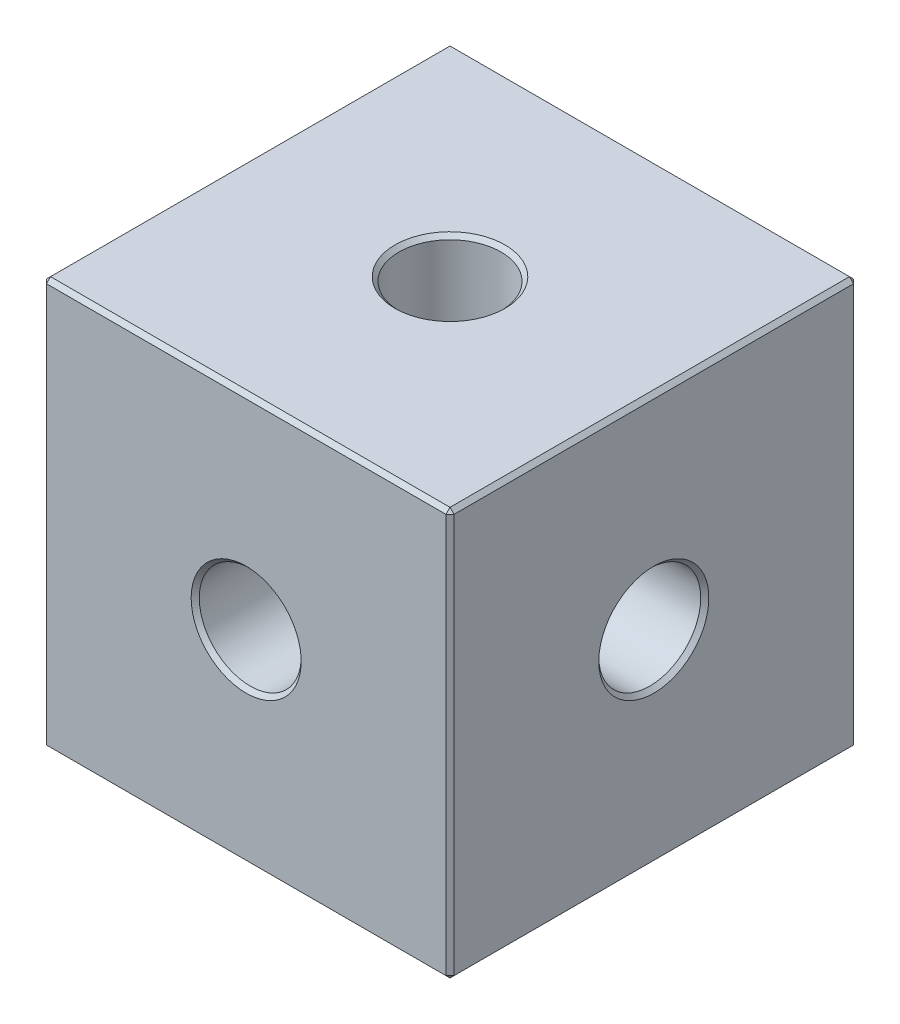
ISO-10303-21;
HEADER;
FILE_DESCRIPTION(('STEP AP214'),'2;1');
FILE_NAME('part.step','',(''),(''),'','','');
FILE_SCHEMA(('AUTOMOTIVE_DESIGN { 1 0 10303 214 1 1 1 1 }'));
ENDSEC;
DATA;
#1=APPLICATION_CONTEXT('core data for automotive mechanical design processes');
#2=APPLICATION_PROTOCOL_DEFINITION('international standard','automotive_design',2000,#1);
#3=PRODUCT_CONTEXT('',#1,'mechanical');
#4=PRODUCT('Part','Part','',(#3));
#5=PRODUCT_RELATED_PRODUCT_CATEGORY('part','',(#4));
#6=PRODUCT_DEFINITION_FORMATION('','',#4);
#7=PRODUCT_DEFINITION_CONTEXT('part definition',#1,'design');
#8=PRODUCT_DEFINITION('design','',#6,#7);
#9=PRODUCT_DEFINITION_SHAPE('','',#8);
#10=(LENGTH_UNIT() NAMED_UNIT(*) SI_UNIT(.MILLI.,.METRE.));
#11=(NAMED_UNIT(*) PLANE_ANGLE_UNIT() SI_UNIT($,.RADIAN.));
#12=(NAMED_UNIT(*) SI_UNIT($,.STERADIAN.) SOLID_ANGLE_UNIT());
#13=UNCERTAINTY_MEASURE_WITH_UNIT(LENGTH_MEASURE(1.E-05),#10,'distance_accuracy_value','');
#14=(GEOMETRIC_REPRESENTATION_CONTEXT(3) GLOBAL_UNCERTAINTY_ASSIGNED_CONTEXT((#13)) GLOBAL_UNIT_ASSIGNED_CONTEXT((#10,
#11,#12)) REPRESENTATION_CONTEXT('',''));
#15=CARTESIAN_POINT('',(0.,0.,0.));
#16=DIRECTION('',(0.,0.,1.));
#17=DIRECTION('',(1.,0.,0.));
#18=AXIS2_PLACEMENT_3D('',#15,#16,#17);
#19=CARTESIAN_POINT('',(0.,0.,10.));
#20=DIRECTION('',(0.,0.,1.));
#21=DIRECTION('',(1.,0.,0.));
#22=AXIS2_PLACEMENT_3D('',#19,#20,#21);
#23=CYLINDRICAL_SURFACE('',#22,2.5);
#24=CARTESIAN_POINT('',(0.,0.,9.80000000000002));
#25=DIRECTION('',(0.,0.,-1.));
#26=DIRECTION('',(-1.,0.,0.));
#27=AXIS2_PLACEMENT_3D('',#24,#25,#26);
#28=CIRCLE('',#27,2.5);
#29=CARTESIAN_POINT('',(-2.5,0.,9.80000000000002));
#30=VERTEX_POINT('',#29);
#31=EDGE_CURVE('E251',#30,#30,#28,.F.);
#32=ORIENTED_EDGE('',*,*,#31,.T.);
#33=EDGE_LOOP('',(#32));
#34=FACE_BOUND('',#33,.T.);
#35=CARTESIAN_POINT('',(0.,0.,0.));
#36=DIRECTION('',(0.,0.707106781186547,0.707106781186547));
#37=DIRECTION('',(0.,-0.707106781186547,0.707106781186547));
#38=AXIS2_PLACEMENT_3D('',#35,#36,#37);
#39=ELLIPSE('',#38,3.53553390593273,2.5);
#40=CARTESIAN_POINT('',(1.76776695296637,-1.76776695296637,1.76776695296637));
#41=VERTEX_POINT('',#40);
#42=CARTESIAN_POINT('',(-1.76776695296637,-1.76776695296637,1.76776695296637));
#43=VERTEX_POINT('',#42);
#44=EDGE_CURVE('E167',#41,#43,#39,.F.);
#45=ORIENTED_EDGE('',*,*,#44,.T.);
#46=CARTESIAN_POINT('',(0.,0.,0.));
#47=DIRECTION('',(0.707106781186548,0.,0.707106781186547));
#48=DIRECTION('',(-0.707106781186547,0.,0.707106781186547));
#49=AXIS2_PLACEMENT_3D('',#46,#47,#48);
#50=ELLIPSE('',#49,3.53553390593273,2.5);
#51=CARTESIAN_POINT('',(-1.76776695296637,1.76776695296637,1.76776695296637));
#52=VERTEX_POINT('',#51);
#53=EDGE_CURVE('E161',#43,#52,#50,.F.);
#54=ORIENTED_EDGE('',*,*,#53,.T.);
#55=CARTESIAN_POINT('',(0.,0.,0.));
#56=DIRECTION('',(0.,-0.707106781186547,0.707106781186547));
#57=DIRECTION('',(0.,0.707106781186547,0.707106781186547));
#58=AXIS2_PLACEMENT_3D('',#55,#56,#57);
#59=ELLIPSE('',#58,3.53553390593273,2.5);
#60=CARTESIAN_POINT('',(1.76776695296637,1.76776695296637,1.76776695296637));
#61=VERTEX_POINT('',#60);
#62=EDGE_CURVE('E181',#52,#61,#59,.F.);
#63=ORIENTED_EDGE('',*,*,#62,.T.);
#64=CARTESIAN_POINT('',(0.,0.,0.));
#65=DIRECTION('',(-0.707106781186547,0.,0.707106781186547));
#66=DIRECTION('',(0.707106781186548,0.,0.707106781186547));
#67=AXIS2_PLACEMENT_3D('',#64,#65,#66);
#68=ELLIPSE('',#67,3.53553390593273,2.5);
#69=EDGE_CURVE('E618',#61,#41,#68,.F.);
#70=ORIENTED_EDGE('',*,*,#69,.T.);
#71=EDGE_LOOP('',(#45,#54,#63,#70));
#72=FACE_BOUND('',#71,.T.);
#73=ADVANCED_FACE('F41',(#34,#72),#23,.F.);
#74=CARTESIAN_POINT('',(10.,10.,-10.));
#75=DIRECTION('',(-1.,0.,0.));
#76=DIRECTION('',(0.,0.,1.));
#77=AXIS2_PLACEMENT_3D('',#74,#75,#76);
#78=PLANE('',#77);
#79=CARTESIAN_POINT('',(10.,0.,0.));
#80=DIRECTION('',(-1.,0.,0.));
#81=DIRECTION('',(0.,0.,1.));
#82=AXIS2_PLACEMENT_3D('',#79,#80,#81);
#83=CIRCLE('',#82,2.7);
#84=CARTESIAN_POINT('',(10.,0.,2.7));
#85=VERTEX_POINT('',#84);
#86=EDGE_CURVE('E248',#85,#85,#83,.T.);
#87=ORIENTED_EDGE('',*,*,#86,.T.);
#88=EDGE_LOOP('',(#87));
#89=FACE_BOUND('',#88,.T.);
#90=DIRECTION('',(0.,0.,-1.));
#91=VECTOR('',#90,1.);
#92=CARTESIAN_POINT('',(10.,-9.8,-10.));
#93=LINE('',#92,#91);
#94=CARTESIAN_POINT('',(10.,-9.8,9.8));
#95=VERTEX_POINT('',#94);
#96=CARTESIAN_POINT('',(10.,-9.8,-9.8));
#97=VERTEX_POINT('',#96);
#98=EDGE_CURVE('E243',#95,#97,#93,.T.);
#99=ORIENTED_EDGE('',*,*,#98,.T.);
#100=DIRECTION('',(0.,1.,0.));
#101=VECTOR('',#100,1.);
#102=CARTESIAN_POINT('',(10.,10.,-9.8));
#103=LINE('',#102,#101);
#104=CARTESIAN_POINT('',(10.,9.8,-9.8));
#105=VERTEX_POINT('',#104);
#106=EDGE_CURVE('E245',#97,#105,#103,.T.);
#107=ORIENTED_EDGE('',*,*,#106,.T.);
#108=DIRECTION('',(0.,0.,1.));
#109=VECTOR('',#108,1.);
#110=CARTESIAN_POINT('',(10.,9.8,10.));
#111=LINE('',#110,#109);
#112=CARTESIAN_POINT('',(10.,9.8,9.8));
#113=VERTEX_POINT('',#112);
#114=EDGE_CURVE('E239',#105,#113,#111,.T.);
#115=ORIENTED_EDGE('',*,*,#114,.T.);
#116=DIRECTION('',(0.,-1.,0.));
#117=VECTOR('',#116,1.);
#118=CARTESIAN_POINT('',(10.,10.,9.8));
#119=LINE('',#118,#117);
#120=EDGE_CURVE('E241',#113,#95,#119,.T.);
#121=ORIENTED_EDGE('',*,*,#120,.T.);
#122=EDGE_LOOP('',(#99,#107,#115,#121));
#123=FACE_BOUND('',#122,.T.);
#124=ADVANCED_FACE('F352',(#89,#123),#78,.F.);
#125=CARTESIAN_POINT('',(-10.,10.,-10.));
#126=DIRECTION('',(0.,0.,1.));
#127=DIRECTION('',(1.,0.,0.));
#128=AXIS2_PLACEMENT_3D('',#125,#126,#127);
#129=PLANE('',#128);
#130=CARTESIAN_POINT('',(0.,0.,-10.));
#131=DIRECTION('',(0.,0.,1.));
#132=DIRECTION('',(1.,0.,0.));
#133=AXIS2_PLACEMENT_3D('',#130,#131,#132);
#134=CIRCLE('',#133,2.69999999999999);
#135=CARTESIAN_POINT('',(2.69999999999999,0.,-10.));
#136=VERTEX_POINT('',#135);
#137=EDGE_CURVE('E230',#136,#136,#134,.T.);
#138=ORIENTED_EDGE('',*,*,#137,.T.);
#139=EDGE_LOOP('',(#138));
#140=FACE_BOUND('',#139,.T.);
#141=DIRECTION('',(-1.,0.,0.));
#142=VECTOR('',#141,1.);
#143=CARTESIAN_POINT('',(-10.,-9.8,-10.));
#144=LINE('',#143,#142);
#145=CARTESIAN_POINT('',(9.8,-9.8,-10.));
#146=VERTEX_POINT('',#145);
#147=CARTESIAN_POINT('',(-9.80000000000001,-9.8,-10.));
#148=VERTEX_POINT('',#147);
#149=EDGE_CURVE('E225',#146,#148,#144,.T.);
#150=ORIENTED_EDGE('',*,*,#149,.T.);
#151=DIRECTION('',(0.,1.,0.));
#152=VECTOR('',#151,1.);
#153=CARTESIAN_POINT('',(-9.80000000000001,10.,-10.));
#154=LINE('',#153,#152);
#155=CARTESIAN_POINT('',(-9.80000000000001,9.8,-10.));
#156=VERTEX_POINT('',#155);
#157=EDGE_CURVE('E227',#148,#156,#154,.T.);
#158=ORIENTED_EDGE('',*,*,#157,.T.);
#159=DIRECTION('',(1.,0.,0.));
#160=VECTOR('',#159,1.);
#161=CARTESIAN_POINT('',(10.,9.8,-10.));
#162=LINE('',#161,#160);
#163=CARTESIAN_POINT('',(9.8,9.8,-10.));
#164=VERTEX_POINT('',#163);
#165=EDGE_CURVE('E221',#156,#164,#162,.T.);
#166=ORIENTED_EDGE('',*,*,#165,.T.);
#167=DIRECTION('',(0.,-1.,0.));
#168=VECTOR('',#167,1.);
#169=CARTESIAN_POINT('',(9.8,10.,-10.));
#170=LINE('',#169,#168);
#171=EDGE_CURVE('E223',#164,#146,#170,.T.);
#172=ORIENTED_EDGE('',*,*,#171,.T.);
#173=EDGE_LOOP('',(#150,#158,#166,#172));
#174=FACE_BOUND('',#173,.T.);
#175=ADVANCED_FACE('F373',(#140,#174),#129,.F.);
#176=CARTESIAN_POINT('',(-10.,10.,-10.));
#177=DIRECTION('',(1.,0.,0.));
#178=DIRECTION('',(0.,0.,-1.));
#179=AXIS2_PLACEMENT_3D('',#176,#177,#178);
#180=PLANE('',#179);
#181=CARTESIAN_POINT('',(-10.,0.,0.));
#182=DIRECTION('',(1.,0.,0.));
#183=DIRECTION('',(0.,0.,-1.));
#184=AXIS2_PLACEMENT_3D('',#181,#182,#183);
#185=CIRCLE('',#184,2.69999999999998);
#186=CARTESIAN_POINT('',(-10.,0.,-2.69999999999998));
#187=VERTEX_POINT('',#186);
#188=EDGE_CURVE('E215',#187,#187,#185,.T.);
#189=ORIENTED_EDGE('',*,*,#188,.T.);
#190=EDGE_LOOP('',(#189));
#191=FACE_BOUND('',#190,.T.);
#192=DIRECTION('',(0.,-1.,0.));
#193=VECTOR('',#192,1.);
#194=CARTESIAN_POINT('',(-10.,10.,-9.8));
#195=LINE('',#194,#193);
#196=CARTESIAN_POINT('',(-10.,9.8,-9.8));
#197=VERTEX_POINT('',#196);
#198=CARTESIAN_POINT('',(-10.,-9.8,-9.8));
#199=VERTEX_POINT('',#198);
#200=EDGE_CURVE('E210',#197,#199,#195,.T.);
#201=ORIENTED_EDGE('',*,*,#200,.T.);
#202=DIRECTION('',(0.,0.,1.));
#203=VECTOR('',#202,1.);
#204=CARTESIAN_POINT('',(-10.,-9.8,-10.));
#205=LINE('',#204,#203);
#206=CARTESIAN_POINT('',(-10.,-9.8,9.8));
#207=VERTEX_POINT('',#206);
#208=EDGE_CURVE('E212',#199,#207,#205,.T.);
#209=ORIENTED_EDGE('',*,*,#208,.T.);
#210=DIRECTION('',(0.,1.,0.));
#211=VECTOR('',#210,1.);
#212=CARTESIAN_POINT('',(-10.,10.,9.8));
#213=LINE('',#212,#211);
#214=CARTESIAN_POINT('',(-10.,9.8,9.8));
#215=VERTEX_POINT('',#214);
#216=EDGE_CURVE('E208',#207,#215,#213,.T.);
#217=ORIENTED_EDGE('',*,*,#216,.T.);
#218=DIRECTION('',(0.,0.,-1.));
#219=VECTOR('',#218,1.);
#220=CARTESIAN_POINT('',(-10.,9.8,-10.));
#221=LINE('',#220,#219);
#222=EDGE_CURVE('E206',#215,#197,#221,.T.);
#223=ORIENTED_EDGE('',*,*,#222,.T.);
#224=EDGE_LOOP('',(#201,#209,#217,#223));
#225=FACE_BOUND('',#224,.T.);
#226=ADVANCED_FACE('F434',(#191,#225),#180,.F.);
#227=CARTESIAN_POINT('',(-10.,10.,10.));
#228=DIRECTION('',(0.,0.,-1.));
#229=DIRECTION('',(-1.,0.,0.));
#230=AXIS2_PLACEMENT_3D('',#227,#228,#229);
#231=PLANE('',#230);
#232=CARTESIAN_POINT('',(0.,0.,10.));
#233=DIRECTION('',(0.,0.,-1.));
#234=DIRECTION('',(-1.,0.,0.));
#235=AXIS2_PLACEMENT_3D('',#232,#233,#234);
#236=CIRCLE('',#235,2.69999999999998);
#237=CARTESIAN_POINT('',(-2.69999999999998,0.,10.));
#238=VERTEX_POINT('',#237);
#239=EDGE_CURVE('E263',#238,#238,#236,.T.);
#240=ORIENTED_EDGE('',*,*,#239,.T.);
#241=EDGE_LOOP('',(#240));
#242=FACE_BOUND('',#241,.T.);
#243=DIRECTION('',(-1.,0.,0.));
#244=VECTOR('',#243,1.);
#245=CARTESIAN_POINT('',(-10.,9.8,10.));
#246=LINE('',#245,#244);
#247=CARTESIAN_POINT('',(9.80000000000001,9.8,10.));
#248=VERTEX_POINT('',#247);
#249=CARTESIAN_POINT('',(-9.8,9.8,10.));
#250=VERTEX_POINT('',#249);
#251=EDGE_CURVE('E254',#248,#250,#246,.T.);
#252=ORIENTED_EDGE('',*,*,#251,.T.);
#253=DIRECTION('',(0.,-1.,0.));
#254=VECTOR('',#253,1.);
#255=CARTESIAN_POINT('',(-9.8,10.,10.));
#256=LINE('',#255,#254);
#257=CARTESIAN_POINT('',(-9.8,-9.8,10.));
#258=VERTEX_POINT('',#257);
#259=EDGE_CURVE('E260',#250,#258,#256,.T.);
#260=ORIENTED_EDGE('',*,*,#259,.T.);
#261=DIRECTION('',(1.,0.,0.));
#262=VECTOR('',#261,1.);
#263=CARTESIAN_POINT('',(-10.,-9.8,10.));
#264=LINE('',#263,#262);
#265=CARTESIAN_POINT('',(9.80000000000001,-9.8,10.));
#266=VERTEX_POINT('',#265);
#267=EDGE_CURVE('E258',#258,#266,#264,.T.);
#268=ORIENTED_EDGE('',*,*,#267,.T.);
#269=DIRECTION('',(0.,1.,0.));
#270=VECTOR('',#269,1.);
#271=CARTESIAN_POINT('',(9.80000000000001,10.,10.));
#272=LINE('',#271,#270);
#273=EDGE_CURVE('E256',#266,#248,#272,.T.);
#274=ORIENTED_EDGE('',*,*,#273,.T.);
#275=EDGE_LOOP('',(#252,#260,#268,#274));
#276=FACE_BOUND('',#275,.T.);
#277=ADVANCED_FACE('F439',(#242,#276),#231,.F.);
#278=CARTESIAN_POINT('',(0.,10.,0.));
#279=DIRECTION('',(0.,1.,0.));
#280=DIRECTION('',(0.,0.,1.));
#281=AXIS2_PLACEMENT_3D('',#278,#279,#280);
#282=PLANE('',#281);
#283=DIRECTION('',(0.,0.,1.));
#284=VECTOR('',#283,1.);
#285=CARTESIAN_POINT('',(-9.8,10.,10.));
#286=LINE('',#285,#284);
#287=CARTESIAN_POINT('',(-9.80000000000001,10.,-9.8));
#288=VERTEX_POINT('',#287);
#289=CARTESIAN_POINT('',(-9.8,10.,9.80000000000001));
#290=VERTEX_POINT('',#289);
#291=EDGE_CURVE('E59',#288,#290,#286,.T.);
#292=ORIENTED_EDGE('',*,*,#291,.T.);
#293=DIRECTION('',(1.,0.,0.));
#294=VECTOR('',#293,1.);
#295=CARTESIAN_POINT('',(10.,10.,9.80000000000001));
#296=LINE('',#295,#294);
#297=CARTESIAN_POINT('',(9.80000000000001,10.,9.80000000000001));
#298=VERTEX_POINT('',#297);
#299=EDGE_CURVE('E51',#290,#298,#296,.T.);
#300=ORIENTED_EDGE('',*,*,#299,.T.);
#301=DIRECTION('',(0.,0.,-1.));
#302=VECTOR('',#301,1.);
#303=CARTESIAN_POINT('',(9.8,10.,-10.));
#304=LINE('',#303,#302);
#305=CARTESIAN_POINT('',(9.8,10.,-9.8));
#306=VERTEX_POINT('',#305);
#307=EDGE_CURVE('E269',#298,#306,#304,.T.);
#308=ORIENTED_EDGE('',*,*,#307,.T.);
#309=DIRECTION('',(-1.,0.,0.));
#310=VECTOR('',#309,1.);
#311=CARTESIAN_POINT('',(-10.,10.,-9.8));
#312=LINE('',#311,#310);
#313=EDGE_CURVE('E64',#306,#288,#312,.T.);
#314=ORIENTED_EDGE('',*,*,#313,.T.);
#315=EDGE_LOOP('',(#292,#300,#308,#314));
#316=FACE_BOUND('',#315,.T.);
#317=CARTESIAN_POINT('',(0.,10.,0.));
#318=DIRECTION('',(0.,1.,0.));
#319=DIRECTION('',(0.,0.,1.));
#320=AXIS2_PLACEMENT_3D('',#317,#318,#319);
#321=CIRCLE('',#320,2.7);
#322=CARTESIAN_POINT('',(0.,10.,2.7));
#323=VERTEX_POINT('',#322);
#324=EDGE_CURVE('E266',#323,#323,#321,.F.);
#325=ORIENTED_EDGE('',*,*,#324,.T.);
#326=EDGE_LOOP('',(#325));
#327=FACE_BOUND('',#326,.T.);
#328=ADVANCED_FACE('F420',(#316,#327),#282,.T.);
#329=CARTESIAN_POINT('',(0.,-10.,0.));
#330=DIRECTION('',(0.,1.,0.));
#331=DIRECTION('',(0.,0.,1.));
#332=AXIS2_PLACEMENT_3D('',#329,#330,#331);
#333=PLANE('',#332);
#334=CARTESIAN_POINT('',(0.,-10.,0.));
#335=DIRECTION('',(0.,1.,0.));
#336=DIRECTION('',(0.,0.,1.));
#337=AXIS2_PLACEMENT_3D('',#334,#335,#336);
#338=CIRCLE('',#337,2.69999999999999);
#339=CARTESIAN_POINT('',(0.,-10.,2.69999999999999));
#340=VERTEX_POINT('',#339);
#341=EDGE_CURVE('E200',#340,#340,#338,.T.);
#342=ORIENTED_EDGE('',*,*,#341,.T.);
#343=EDGE_LOOP('',(#342));
#344=FACE_BOUND('',#343,.T.);
#345=DIRECTION('',(-1.,0.,0.));
#346=VECTOR('',#345,1.);
#347=CARTESIAN_POINT('',(0.,-10.,9.80000000000001));
#348=LINE('',#347,#346);
#349=CARTESIAN_POINT('',(9.80000000000001,-10.,9.80000000000001));
#350=VERTEX_POINT('',#349);
#351=CARTESIAN_POINT('',(-9.8,-10.,9.80000000000001));
#352=VERTEX_POINT('',#351);
#353=EDGE_CURVE('E191',#350,#352,#348,.T.);
#354=ORIENTED_EDGE('',*,*,#353,.T.);
#355=DIRECTION('',(0.,0.,-1.));
#356=VECTOR('',#355,1.);
#357=CARTESIAN_POINT('',(-9.8,-10.,0.));
#358=LINE('',#357,#356);
#359=CARTESIAN_POINT('',(-9.80000000000001,-10.,-9.8));
#360=VERTEX_POINT('',#359);
#361=EDGE_CURVE('E197',#352,#360,#358,.T.);
#362=ORIENTED_EDGE('',*,*,#361,.T.);
#363=DIRECTION('',(1.,0.,0.));
#364=VECTOR('',#363,1.);
#365=CARTESIAN_POINT('',(0.,-10.,-9.8));
#366=LINE('',#365,#364);
#367=CARTESIAN_POINT('',(9.8,-10.,-9.8));
#368=VERTEX_POINT('',#367);
#369=EDGE_CURVE('E195',#360,#368,#366,.T.);
#370=ORIENTED_EDGE('',*,*,#369,.T.);
#371=DIRECTION('',(0.,0.,1.));
#372=VECTOR('',#371,1.);
#373=CARTESIAN_POINT('',(9.8,-10.,0.));
#374=LINE('',#373,#372);
#375=EDGE_CURVE('E193',#368,#350,#374,.T.);
#376=ORIENTED_EDGE('',*,*,#375,.T.);
#377=EDGE_LOOP('',(#354,#362,#370,#376));
#378=FACE_BOUND('',#377,.T.);
#379=ADVANCED_FACE('F413',(#344,#378),#333,.F.);
#380=CARTESIAN_POINT('',(0.,0.,-9.8));
#381=DIRECTION('',(0.,0.,1.));
#382=DIRECTION('',(1.,0.,0.));
#383=AXIS2_PLACEMENT_3D('',#380,#381,#382);
#384=CIRCLE('',#383,2.5);
#385=CARTESIAN_POINT('',(2.5,0.,-9.8));
#386=VERTEX_POINT('',#385);
#387=EDGE_CURVE('E233',#386,#386,#384,.F.);
#388=ORIENTED_EDGE('',*,*,#387,.T.);
#389=EDGE_LOOP('',(#388));
#390=FACE_BOUND('',#389,.T.);
#391=CARTESIAN_POINT('',(0.,0.,0.));
#392=DIRECTION('',(0.,-0.707106781186547,0.707106781186547));
#393=DIRECTION('',(0.,0.707106781186547,0.707106781186547));
#394=AXIS2_PLACEMENT_3D('',#391,#392,#393);
#395=ELLIPSE('',#394,3.53553390593273,2.5);
#396=CARTESIAN_POINT('',(-1.76776695296637,-1.76776695296637,-1.76776695296637));
#397=VERTEX_POINT('',#396);
#398=CARTESIAN_POINT('',(1.76776695296637,-1.76776695296637,-1.76776695296637));
#399=VERTEX_POINT('',#398);
#400=EDGE_CURVE('E174',#397,#399,#395,.T.);
#401=ORIENTED_EDGE('',*,*,#400,.T.);
#402=CARTESIAN_POINT('',(0.,0.,0.));
#403=DIRECTION('',(0.707106781186548,0.,0.707106781186547));
#404=DIRECTION('',(-0.707106781186547,0.,0.707106781186547));
#405=AXIS2_PLACEMENT_3D('',#402,#403,#404);
#406=ELLIPSE('',#405,3.53553390593273,2.5);
#407=CARTESIAN_POINT('',(1.76776695296637,1.76776695296637,-1.76776695296637));
#408=VERTEX_POINT('',#407);
#409=EDGE_CURVE('E619',#399,#408,#406,.T.);
#410=ORIENTED_EDGE('',*,*,#409,.T.);
#411=CARTESIAN_POINT('',(0.,0.,0.));
#412=DIRECTION('',(0.,0.707106781186547,0.707106781186547));
#413=DIRECTION('',(0.,-0.707106781186547,0.707106781186547));
#414=AXIS2_PLACEMENT_3D('',#411,#412,#413);
#415=ELLIPSE('',#414,3.53553390593273,2.5);
#416=CARTESIAN_POINT('',(-1.76776695296637,1.76776695296637,-1.76776695296637));
#417=VERTEX_POINT('',#416);
#418=EDGE_CURVE('E176',#408,#417,#415,.T.);
#419=ORIENTED_EDGE('',*,*,#418,.T.);
#420=CARTESIAN_POINT('',(0.,0.,0.));
#421=DIRECTION('',(-0.707106781186547,0.,0.707106781186547));
#422=DIRECTION('',(0.707106781186548,0.,0.707106781186547));
#423=AXIS2_PLACEMENT_3D('',#420,#421,#422);
#424=ELLIPSE('',#423,3.53553390593273,2.5);
#425=EDGE_CURVE('E158',#417,#397,#424,.T.);
#426=ORIENTED_EDGE('',*,*,#425,.T.);
#427=EDGE_LOOP('',(#401,#410,#419,#426));
#428=FACE_BOUND('',#427,.T.);
#429=ADVANCED_FACE('F172',(#390,#428),#23,.F.);
#430=CARTESIAN_POINT('',(0.,10.,0.));
#431=DIRECTION('',(0.,1.,0.));
#432=DIRECTION('',(0.,0.,1.));
#433=AXIS2_PLACEMENT_3D('',#430,#431,#432);
#434=CYLINDRICAL_SURFACE('',#433,2.5);
#435=CARTESIAN_POINT('',(0.,9.79999999999999,0.));
#436=DIRECTION('',(0.,1.,0.));
#437=DIRECTION('',(0.,0.,1.));
#438=AXIS2_PLACEMENT_3D('',#435,#436,#437);
#439=CIRCLE('',#438,2.5);
#440=CARTESIAN_POINT('',(0.,9.79999999999999,2.5));
#441=VERTEX_POINT('',#440);
#442=EDGE_CURVE('E11',#441,#441,#439,.T.);
#443=ORIENTED_EDGE('',*,*,#442,.T.);
#444=EDGE_LOOP('',(#443));
#445=FACE_BOUND('',#444,.T.);
#446=ORIENTED_EDGE('',*,*,#62,.F.);
#447=CARTESIAN_POINT('',(0.,0.,0.));
#448=DIRECTION('',(0.707106781186547,0.707106781186547,0.));
#449=DIRECTION('',(-0.707106781186547,0.707106781186547,0.));
#450=AXIS2_PLACEMENT_3D('',#447,#448,#449);
#451=ELLIPSE('',#450,3.53553390593273,2.5);
#452=EDGE_CURVE('E177',#52,#417,#451,.F.);
#453=ORIENTED_EDGE('',*,*,#452,.T.);
#454=ORIENTED_EDGE('',*,*,#418,.F.);
#455=CARTESIAN_POINT('',(0.,0.,0.));
#456=DIRECTION('',(-0.707106781186547,0.707106781186547,0.));
#457=DIRECTION('',(0.707106781186547,0.707106781186547,0.));
#458=AXIS2_PLACEMENT_3D('',#455,#456,#457);
#459=ELLIPSE('',#458,3.53553390593273,2.5);
#460=EDGE_CURVE('E185',#408,#61,#459,.F.);
#461=ORIENTED_EDGE('',*,*,#460,.T.);
#462=EDGE_LOOP('',(#446,#453,#454,#461));
#463=FACE_BOUND('',#462,.T.);
#464=ADVANCED_FACE('F412',(#445,#463),#434,.F.);
#465=CARTESIAN_POINT('',(0.,-9.8,0.));
#466=DIRECTION('',(0.,1.,0.));
#467=DIRECTION('',(0.,0.,1.));
#468=AXIS2_PLACEMENT_3D('',#465,#466,#467);
#469=CIRCLE('',#468,2.5);
#470=CARTESIAN_POINT('',(0.,-9.8,2.5));
#471=VERTEX_POINT('',#470);
#472=EDGE_CURVE('E203',#471,#471,#469,.F.);
#473=ORIENTED_EDGE('',*,*,#472,.T.);
#474=EDGE_LOOP('',(#473));
#475=FACE_BOUND('',#474,.T.);
#476=ORIENTED_EDGE('',*,*,#44,.F.);
#477=CARTESIAN_POINT('',(0.,0.,0.));
#478=DIRECTION('',(0.707106781186547,0.707106781186547,0.));
#479=DIRECTION('',(-0.707106781186547,0.707106781186547,0.));
#480=AXIS2_PLACEMENT_3D('',#477,#478,#479);
#481=ELLIPSE('',#480,3.53553390593273,2.5);
#482=EDGE_CURVE('E166',#41,#399,#481,.T.);
#483=ORIENTED_EDGE('',*,*,#482,.T.);
#484=ORIENTED_EDGE('',*,*,#400,.F.);
#485=CARTESIAN_POINT('',(0.,0.,0.));
#486=DIRECTION('',(-0.707106781186547,0.707106781186547,0.));
#487=DIRECTION('',(0.707106781186547,0.707106781186547,0.));
#488=AXIS2_PLACEMENT_3D('',#485,#486,#487);
#489=ELLIPSE('',#488,3.53553390593273,2.5);
#490=EDGE_CURVE('E155',#397,#43,#489,.T.);
#491=ORIENTED_EDGE('',*,*,#490,.T.);
#492=EDGE_LOOP('',(#476,#483,#484,#491));
#493=FACE_BOUND('',#492,.T.);
#494=ADVANCED_FACE('F180',(#475,#493),#434,.F.);
#495=CARTESIAN_POINT('',(10.,0.,0.));
#496=DIRECTION('',(1.,0.,0.));
#497=DIRECTION('',(0.,0.,-1.));
#498=AXIS2_PLACEMENT_3D('',#495,#496,#497);
#499=CYLINDRICAL_SURFACE('',#498,2.5);
#500=CARTESIAN_POINT('',(-9.80000000000001,0.,0.));
#501=DIRECTION('',(1.,0.,0.));
#502=DIRECTION('',(0.,0.,-1.));
#503=AXIS2_PLACEMENT_3D('',#500,#501,#502);
#504=CIRCLE('',#503,2.5);
#505=CARTESIAN_POINT('',(-9.80000000000001,0.,-2.5));
#506=VERTEX_POINT('',#505);
#507=EDGE_CURVE('E218',#506,#506,#504,.F.);
#508=ORIENTED_EDGE('',*,*,#507,.T.);
#509=EDGE_LOOP('',(#508));
#510=FACE_BOUND('',#509,.T.);
#511=ORIENTED_EDGE('',*,*,#490,.F.);
#512=ORIENTED_EDGE('',*,*,#425,.F.);
#513=ORIENTED_EDGE('',*,*,#452,.F.);
#514=ORIENTED_EDGE('',*,*,#53,.F.);
#515=EDGE_LOOP('',(#511,#512,#513,#514));
#516=FACE_BOUND('',#515,.T.);
#517=ADVANCED_FACE('F157',(#510,#516),#499,.F.);
#518=CARTESIAN_POINT('',(9.8,0.,0.));
#519=DIRECTION('',(-1.,0.,0.));
#520=DIRECTION('',(0.,0.,1.));
#521=AXIS2_PLACEMENT_3D('',#518,#519,#520);
#522=CIRCLE('',#521,2.5);
#523=CARTESIAN_POINT('',(9.8,0.,2.49999999999999));
#524=VERTEX_POINT('',#523);
#525=EDGE_CURVE('E236',#524,#524,#522,.F.);
#526=ORIENTED_EDGE('',*,*,#525,.T.);
#527=EDGE_LOOP('',(#526));
#528=FACE_BOUND('',#527,.T.);
#529=ORIENTED_EDGE('',*,*,#409,.F.);
#530=ORIENTED_EDGE('',*,*,#482,.F.);
#531=ORIENTED_EDGE('',*,*,#69,.F.);
#532=ORIENTED_EDGE('',*,*,#460,.F.);
#533=EDGE_LOOP('',(#529,#530,#531,#532));
#534=FACE_BOUND('',#533,.T.);
#535=ADVANCED_FACE('F451',(#528,#534),#499,.F.);
#536=CARTESIAN_POINT('',(0.,-10.,0.));
#537=DIRECTION('',(0.,-1.,0.));
#538=DIRECTION('',(0.,0.,-1.));
#539=AXIS2_PLACEMENT_3D('',#536,#537,#538);
#540=CONICAL_SURFACE('',#539,2.69999999999999,0.785398163397445);
#541=ORIENTED_EDGE('',*,*,#472,.F.);
#542=EDGE_LOOP('',(#541));
#543=FACE_BOUND('',#542,.T.);
#544=ORIENTED_EDGE('',*,*,#341,.F.);
#545=EDGE_LOOP('',(#544));
#546=FACE_BOUND('',#545,.T.);
#547=ADVANCED_FACE('F445',(#543,#546),#540,.F.);
#548=CARTESIAN_POINT('',(-10.,0.,0.));
#549=DIRECTION('',(-1.,0.,0.));
#550=DIRECTION('',(0.,0.,1.));
#551=AXIS2_PLACEMENT_3D('',#548,#549,#550);
#552=CONICAL_SURFACE('',#551,2.69999999999999,0.785398163397444);
#553=ORIENTED_EDGE('',*,*,#507,.F.);
#554=EDGE_LOOP('',(#553));
#555=FACE_BOUND('',#554,.T.);
#556=ORIENTED_EDGE('',*,*,#188,.F.);
#557=EDGE_LOOP('',(#556));
#558=FACE_BOUND('',#557,.T.);
#559=ADVANCED_FACE('F429',(#555,#558),#552,.F.);
#560=CARTESIAN_POINT('',(0.,0.,-10.));
#561=DIRECTION('',(0.,0.,-1.));
#562=DIRECTION('',(-1.,0.,0.));
#563=AXIS2_PLACEMENT_3D('',#560,#561,#562);
#564=CONICAL_SURFACE('',#563,2.69999999999999,0.785398163397445);
#565=ORIENTED_EDGE('',*,*,#387,.F.);
#566=EDGE_LOOP('',(#565));
#567=FACE_BOUND('',#566,.T.);
#568=ORIENTED_EDGE('',*,*,#137,.F.);
#569=EDGE_LOOP('',(#568));
#570=FACE_BOUND('',#569,.T.);
#571=ADVANCED_FACE('F425',(#567,#570),#564,.F.);
#572=CARTESIAN_POINT('',(9.8,0.,0.));
#573=DIRECTION('',(1.,0.,0.));
#574=DIRECTION('',(0.,0.,-1.));
#575=AXIS2_PLACEMENT_3D('',#572,#573,#574);
#576=CONICAL_SURFACE('',#575,2.5,0.785398163397453);
#577=ORIENTED_EDGE('',*,*,#86,.F.);
#578=EDGE_LOOP('',(#577));
#579=FACE_BOUND('',#578,.T.);
#580=ORIENTED_EDGE('',*,*,#525,.F.);
#581=EDGE_LOOP('',(#580));
#582=FACE_BOUND('',#581,.T.);
#583=ADVANCED_FACE('F428',(#579,#582),#576,.F.);
#584=CARTESIAN_POINT('',(0.,0.,9.80000000000002));
#585=DIRECTION('',(0.,0.,1.));
#586=DIRECTION('',(1.,0.,0.));
#587=AXIS2_PLACEMENT_3D('',#584,#585,#586);
#588=CONICAL_SURFACE('',#587,2.5,0.785398163397445);
#589=ORIENTED_EDGE('',*,*,#239,.F.);
#590=EDGE_LOOP('',(#589));
#591=FACE_BOUND('',#590,.T.);
#592=ORIENTED_EDGE('',*,*,#31,.F.);
#593=EDGE_LOOP('',(#592));
#594=FACE_BOUND('',#593,.T.);
#595=ADVANCED_FACE('F467',(#591,#594),#588,.F.);
#596=CARTESIAN_POINT('',(9.8,10.,0.));
#597=DIRECTION('',(0.707106781186547,0.707106781186547,0.));
#598=DIRECTION('',(0.,0.,1.));
#599=AXIS2_PLACEMENT_3D('',#596,#597,#598);
#600=PLANE('',#599);
#601=DIRECTION('',(0.707106781186547,-0.707106781186547,0.));
#602=VECTOR('',#601,1.);
#603=CARTESIAN_POINT('',(10.,9.8,-9.8));
#604=LINE('',#603,#602);
#605=EDGE_CURVE('E46',#306,#105,#604,.T.);
#606=ORIENTED_EDGE('',*,*,#605,.F.);
#607=ORIENTED_EDGE('',*,*,#307,.F.);
#608=DIRECTION('',(-0.707106781186548,0.707106781186548,0.));
#609=VECTOR('',#608,1.);
#610=CARTESIAN_POINT('',(9.9,9.9,9.80000000000001));
#611=LINE('',#610,#609);
#612=EDGE_CURVE('E333',#113,#298,#611,.T.);
#613=ORIENTED_EDGE('',*,*,#612,.F.);
#614=ORIENTED_EDGE('',*,*,#114,.F.);
#615=EDGE_LOOP('',(#606,#607,#613,#614));
#616=FACE_BOUND('',#615,.T.);
#617=ADVANCED_FACE('F349',(#616),#600,.T.);
#618=CARTESIAN_POINT('',(10.,9.8,-9.8));
#619=DIRECTION('',(0.577350269189626,0.577350269189626,-0.577350269189626));
#620=DIRECTION('',(-0.707106781186547,0.,-0.707106781186547));
#621=AXIS2_PLACEMENT_3D('',#618,#619,#620);
#622=PLANE('',#621);
#623=DIRECTION('',(0.,0.707106781186547,0.707106781186547));
#624=VECTOR('',#623,1.);
#625=CARTESIAN_POINT('',(9.8,9.9,-9.9));
#626=LINE('',#625,#624);
#627=EDGE_CURVE('E329',#306,#164,#626,.F.);
#628=ORIENTED_EDGE('',*,*,#627,.F.);
#629=ORIENTED_EDGE('',*,*,#605,.T.);
#630=DIRECTION('',(0.707106781186547,0.,0.707106781186547));
#631=VECTOR('',#630,1.);
#632=CARTESIAN_POINT('',(10.,9.8,-9.8));
#633=LINE('',#632,#631);
#634=EDGE_CURVE('E332',#164,#105,#633,.T.);
#635=ORIENTED_EDGE('',*,*,#634,.F.);
#636=EDGE_LOOP('',(#628,#629,#635));
#637=FACE_BOUND('',#636,.T.);
#638=ADVANCED_FACE('F346',(#637),#622,.T.);
#639=CARTESIAN_POINT('',(9.80000000000001,9.8,10.));
#640=DIRECTION('',(0.577350269189629,0.577350269189624,0.577350269189624));
#641=DIRECTION('',(0.707106781186544,0.,-0.707106781186551));
#642=AXIS2_PLACEMENT_3D('',#639,#640,#641);
#643=PLANE('',#642);
#644=DIRECTION('',(-0.707106781186544,0.,0.707106781186551));
#645=VECTOR('',#644,1.);
#646=CARTESIAN_POINT('',(9.80000000000001,9.8,10.));
#647=LINE('',#646,#645);
#648=EDGE_CURVE('E324',#113,#248,#647,.T.);
#649=ORIENTED_EDGE('',*,*,#648,.F.);
#650=ORIENTED_EDGE('',*,*,#612,.T.);
#651=DIRECTION('',(0.,-0.707106781186547,0.707106781186547));
#652=VECTOR('',#651,1.);
#653=CARTESIAN_POINT('',(9.80000000000001,9.8,10.));
#654=LINE('',#653,#652);
#655=EDGE_CURVE('E327',#248,#298,#654,.F.);
#656=ORIENTED_EDGE('',*,*,#655,.F.);
#657=EDGE_LOOP('',(#649,#650,#656));
#658=FACE_BOUND('',#657,.T.);
#659=ADVANCED_FACE('F397',(#658),#643,.T.);
#660=CARTESIAN_POINT('',(9.8,10.,-10.));
#661=DIRECTION('',(-0.707106781186547,0.,0.707106781186547));
#662=DIRECTION('',(0.,-1.,0.));
#663=AXIS2_PLACEMENT_3D('',#660,#661,#662);
#664=PLANE('',#663);
#665=ORIENTED_EDGE('',*,*,#634,.T.);
#666=ORIENTED_EDGE('',*,*,#106,.F.);
#667=DIRECTION('',(-0.707106781186547,0.,-0.707106781186547));
#668=VECTOR('',#667,1.);
#669=CARTESIAN_POINT('',(9.9,-9.8,-9.9));
#670=LINE('',#669,#668);
#671=EDGE_CURVE('E318',#146,#97,#670,.F.);
#672=ORIENTED_EDGE('',*,*,#671,.F.);
#673=ORIENTED_EDGE('',*,*,#171,.F.);
#674=EDGE_LOOP('',(#665,#666,#672,#673));
#675=FACE_BOUND('',#674,.T.);
#676=ADVANCED_FACE('F357',(#675),#664,.F.);
#677=CARTESIAN_POINT('',(0.,10.,-9.8));
#678=DIRECTION('',(0.,0.707106781186547,-0.707106781186547));
#679=DIRECTION('',(1.,0.,0.));
#680=AXIS2_PLACEMENT_3D('',#677,#678,#679);
#681=PLANE('',#680);
#682=ORIENTED_EDGE('',*,*,#627,.T.);
#683=ORIENTED_EDGE('',*,*,#165,.F.);
#684=DIRECTION('',(0.,-0.707106781186547,-0.707106781186547));
#685=VECTOR('',#684,1.);
#686=CARTESIAN_POINT('',(-9.80000000000001,9.8,-10.));
#687=LINE('',#686,#685);
#688=EDGE_CURVE('E315',#288,#156,#687,.T.);
#689=ORIENTED_EDGE('',*,*,#688,.F.);
#690=ORIENTED_EDGE('',*,*,#313,.F.);
#691=EDGE_LOOP('',(#682,#683,#689,#690));
#692=FACE_BOUND('',#691,.T.);
#693=ADVANCED_FACE('F386',(#692),#681,.T.);
#694=CARTESIAN_POINT('',(-9.8,10.,0.));
#695=DIRECTION('',(-0.707106781186547,0.707106781186547,0.));
#696=DIRECTION('',(0.,0.,-1.));
#697=AXIS2_PLACEMENT_3D('',#694,#695,#696);
#698=PLANE('',#697);
#699=DIRECTION('',(-0.707106781186547,-0.707106781186547,0.));
#700=VECTOR('',#699,1.);
#701=CARTESIAN_POINT('',(-10.,9.8,9.8));
#702=LINE('',#701,#700);
#703=EDGE_CURVE('E309',#290,#215,#702,.T.);
#704=ORIENTED_EDGE('',*,*,#703,.F.);
#705=ORIENTED_EDGE('',*,*,#291,.F.);
#706=DIRECTION('',(0.707106781186548,0.707106781186548,0.));
#707=VECTOR('',#706,1.);
#708=CARTESIAN_POINT('',(-9.9,9.9,-9.8));
#709=LINE('',#708,#707);
#710=EDGE_CURVE('E312',#197,#288,#709,.T.);
#711=ORIENTED_EDGE('',*,*,#710,.F.);
#712=ORIENTED_EDGE('',*,*,#222,.F.);
#713=EDGE_LOOP('',(#704,#705,#711,#712));
#714=FACE_BOUND('',#713,.T.);
#715=ADVANCED_FACE('F388',(#714),#698,.T.);
#716=CARTESIAN_POINT('',(0.,10.,9.80000000000001));
#717=DIRECTION('',(0.,0.707106781186547,0.707106781186547));
#718=DIRECTION('',(-1.,0.,0.));
#719=AXIS2_PLACEMENT_3D('',#716,#717,#718);
#720=PLANE('',#719);
#721=ORIENTED_EDGE('',*,*,#655,.T.);
#722=ORIENTED_EDGE('',*,*,#299,.F.);
#723=DIRECTION('',(0.,0.707106781186547,-0.707106781186547));
#724=VECTOR('',#723,1.);
#725=CARTESIAN_POINT('',(-9.8,9.9,9.9));
#726=LINE('',#725,#724);
#727=EDGE_CURVE('E306',#250,#290,#726,.T.);
#728=ORIENTED_EDGE('',*,*,#727,.F.);
#729=ORIENTED_EDGE('',*,*,#251,.F.);
#730=EDGE_LOOP('',(#721,#722,#728,#729));
#731=FACE_BOUND('',#730,.T.);
#732=ADVANCED_FACE('F394',(#731),#720,.T.);
#733=CARTESIAN_POINT('',(10.,10.,9.8));
#734=DIRECTION('',(-0.707106781186551,0.,-0.707106781186544));
#735=DIRECTION('',(0.,-1.,0.));
#736=AXIS2_PLACEMENT_3D('',#733,#734,#735);
#737=PLANE('',#736);
#738=ORIENTED_EDGE('',*,*,#648,.T.);
#739=ORIENTED_EDGE('',*,*,#273,.F.);
#740=DIRECTION('',(0.707106781186544,0.,-0.707106781186551));
#741=VECTOR('',#740,1.);
#742=CARTESIAN_POINT('',(9.9,-9.8,9.9));
#743=LINE('',#742,#741);
#744=EDGE_CURVE('E303',#95,#266,#743,.F.);
#745=ORIENTED_EDGE('',*,*,#744,.F.);
#746=ORIENTED_EDGE('',*,*,#120,.F.);
#747=EDGE_LOOP('',(#738,#739,#745,#746));
#748=FACE_BOUND('',#747,.T.);
#749=ADVANCED_FACE('F550',(#748),#737,.F.);
#750=CARTESIAN_POINT('',(10.,-9.8,-10.));
#751=DIRECTION('',(-0.707106781186547,0.707106781186547,0.));
#752=DIRECTION('',(0.,0.,-1.));
#753=AXIS2_PLACEMENT_3D('',#750,#751,#752);
#754=PLANE('',#753);
#755=DIRECTION('',(0.707106781186547,0.707106781186547,0.));
#756=VECTOR('',#755,1.);
#757=CARTESIAN_POINT('',(9.8,-10.,-9.8));
#758=LINE('',#757,#756);
#759=EDGE_CURVE('E321',#97,#368,#758,.F.);
#760=ORIENTED_EDGE('',*,*,#759,.F.);
#761=ORIENTED_EDGE('',*,*,#98,.F.);
#762=DIRECTION('',(-0.707106781186548,-0.707106781186548,0.));
#763=VECTOR('',#762,1.);
#764=CARTESIAN_POINT('',(9.80000000000001,-10.,9.80000000000001));
#765=LINE('',#764,#763);
#766=EDGE_CURVE('E300',#350,#95,#765,.F.);
#767=ORIENTED_EDGE('',*,*,#766,.F.);
#768=ORIENTED_EDGE('',*,*,#375,.F.);
#769=EDGE_LOOP('',(#760,#761,#767,#768));
#770=FACE_BOUND('',#769,.T.);
#771=ADVANCED_FACE('F361',(#770),#754,.F.);
#772=CARTESIAN_POINT('',(9.8,-10.,-9.8));
#773=DIRECTION('',(0.577350269189626,-0.577350269189626,-0.577350269189626));
#774=DIRECTION('',(-0.707106781186547,0.,-0.707106781186547));
#775=AXIS2_PLACEMENT_3D('',#772,#773,#774);
#776=PLANE('',#775);
#777=ORIENTED_EDGE('',*,*,#671,.T.);
#778=ORIENTED_EDGE('',*,*,#759,.T.);
#779=DIRECTION('',(0.,-0.707106781186547,0.707106781186547));
#780=VECTOR('',#779,1.);
#781=CARTESIAN_POINT('',(9.8,-10.,-9.8));
#782=LINE('',#781,#780);
#783=EDGE_CURVE('E297',#146,#368,#782,.T.);
#784=ORIENTED_EDGE('',*,*,#783,.F.);
#785=EDGE_LOOP('',(#777,#778,#784));
#786=FACE_BOUND('',#785,.T.);
#787=ADVANCED_FACE('F365',(#786),#776,.T.);
#788=CARTESIAN_POINT('',(-9.80000000000001,9.8,-10.));
#789=DIRECTION('',(-0.577350269189626,0.577350269189626,-0.577350269189626));
#790=DIRECTION('',(-0.707106781186547,0.,0.707106781186547));
#791=AXIS2_PLACEMENT_3D('',#788,#789,#790);
#792=PLANE('',#791);
#793=ORIENTED_EDGE('',*,*,#710,.T.);
#794=ORIENTED_EDGE('',*,*,#688,.T.);
#795=DIRECTION('',(0.707106781186547,0.,-0.707106781186547));
#796=VECTOR('',#795,1.);
#797=CARTESIAN_POINT('',(-9.80000000000001,9.8,-10.));
#798=LINE('',#797,#796);
#799=EDGE_CURVE('E295',#197,#156,#798,.T.);
#800=ORIENTED_EDGE('',*,*,#799,.F.);
#801=EDGE_LOOP('',(#793,#794,#800));
#802=FACE_BOUND('',#801,.T.);
#803=ADVANCED_FACE('F383',(#802),#792,.T.);
#804=CARTESIAN_POINT('',(-10.,9.8,9.8));
#805=DIRECTION('',(-0.577350269189629,0.577350269189624,0.577350269189624));
#806=DIRECTION('',(0.707106781186544,0.,0.707106781186551));
#807=AXIS2_PLACEMENT_3D('',#804,#805,#806);
#808=PLANE('',#807);
#809=ORIENTED_EDGE('',*,*,#727,.T.);
#810=ORIENTED_EDGE('',*,*,#703,.T.);
#811=DIRECTION('',(-0.707106781186544,0.,-0.707106781186551));
#812=VECTOR('',#811,1.);
#813=CARTESIAN_POINT('',(-10.,9.8,9.8));
#814=LINE('',#813,#812);
#815=EDGE_CURVE('E292',#250,#215,#814,.T.);
#816=ORIENTED_EDGE('',*,*,#815,.F.);
#817=EDGE_LOOP('',(#809,#810,#816));
#818=FACE_BOUND('',#817,.T.);
#819=ADVANCED_FACE('F527',(#818),#808,.T.);
#820=CARTESIAN_POINT('',(9.80000000000001,-10.,9.80000000000001));
#821=DIRECTION('',(0.577350269189629,-0.577350269189624,0.577350269189624));
#822=DIRECTION('',(0.707106781186544,0.,-0.707106781186551));
#823=AXIS2_PLACEMENT_3D('',#820,#821,#822);
#824=PLANE('',#823);
#825=ORIENTED_EDGE('',*,*,#766,.T.);
#826=ORIENTED_EDGE('',*,*,#744,.T.);
#827=DIRECTION('',(0.,0.707106781186547,0.707106781186547));
#828=VECTOR('',#827,1.);
#829=CARTESIAN_POINT('',(9.80000000000001,-10.,9.80000000000001));
#830=LINE('',#829,#828);
#831=EDGE_CURVE('E289',#350,#266,#830,.T.);
#832=ORIENTED_EDGE('',*,*,#831,.F.);
#833=EDGE_LOOP('',(#825,#826,#832));
#834=FACE_BOUND('',#833,.T.);
#835=ADVANCED_FACE('F521',(#834),#824,.T.);
#836=CARTESIAN_POINT('',(-10.,-9.8,-10.));
#837=DIRECTION('',(0.,0.707106781186547,0.707106781186547));
#838=DIRECTION('',(-1.,0.,0.));
#839=AXIS2_PLACEMENT_3D('',#836,#837,#838);
#840=PLANE('',#839);
#841=ORIENTED_EDGE('',*,*,#783,.T.);
#842=ORIENTED_EDGE('',*,*,#369,.F.);
#843=DIRECTION('',(0.,0.707106781186547,-0.707106781186547));
#844=VECTOR('',#843,1.);
#845=CARTESIAN_POINT('',(-9.80000000000001,-10.,-9.8));
#846=LINE('',#845,#844);
#847=EDGE_CURVE('E286',#148,#360,#846,.F.);
#848=ORIENTED_EDGE('',*,*,#847,.F.);
#849=ORIENTED_EDGE('',*,*,#149,.F.);
#850=EDGE_LOOP('',(#841,#842,#848,#849));
#851=FACE_BOUND('',#850,.T.);
#852=ADVANCED_FACE('F370',(#851),#840,.F.);
#853=CARTESIAN_POINT('',(-10.,10.,-9.8));
#854=DIRECTION('',(0.707106781186547,0.,0.707106781186547));
#855=DIRECTION('',(0.,-1.,0.));
#856=AXIS2_PLACEMENT_3D('',#853,#854,#855);
#857=PLANE('',#856);
#858=ORIENTED_EDGE('',*,*,#799,.T.);
#859=ORIENTED_EDGE('',*,*,#157,.F.);
#860=DIRECTION('',(-0.707106781186547,0.,0.707106781186547));
#861=VECTOR('',#860,1.);
#862=CARTESIAN_POINT('',(-9.9,-9.8,-9.9));
#863=LINE('',#862,#861);
#864=EDGE_CURVE('E283',#199,#148,#863,.F.);
#865=ORIENTED_EDGE('',*,*,#864,.F.);
#866=ORIENTED_EDGE('',*,*,#200,.F.);
#867=EDGE_LOOP('',(#858,#859,#865,#866));
#868=FACE_BOUND('',#867,.T.);
#869=ADVANCED_FACE('F376',(#868),#857,.F.);
#870=CARTESIAN_POINT('',(-9.8,10.,10.));
#871=DIRECTION('',(0.707106781186551,0.,-0.707106781186544));
#872=DIRECTION('',(0.,-1.,0.));
#873=AXIS2_PLACEMENT_3D('',#870,#871,#872);
#874=PLANE('',#873);
#875=ORIENTED_EDGE('',*,*,#815,.T.);
#876=ORIENTED_EDGE('',*,*,#216,.F.);
#877=DIRECTION('',(0.707106781186544,0.,0.707106781186551));
#878=VECTOR('',#877,1.);
#879=CARTESIAN_POINT('',(-10.,-9.8,9.8));
#880=LINE('',#879,#878);
#881=EDGE_CURVE('E280',#258,#207,#880,.F.);
#882=ORIENTED_EDGE('',*,*,#881,.F.);
#883=ORIENTED_EDGE('',*,*,#259,.F.);
#884=EDGE_LOOP('',(#875,#876,#882,#883));
#885=FACE_BOUND('',#884,.T.);
#886=ADVANCED_FACE('F503',(#885),#874,.F.);
#887=CARTESIAN_POINT('',(-10.,-9.8,10.));
#888=DIRECTION('',(0.,0.707106781186547,-0.707106781186547));
#889=DIRECTION('',(1.,0.,0.));
#890=AXIS2_PLACEMENT_3D('',#887,#888,#889);
#891=PLANE('',#890);
#892=ORIENTED_EDGE('',*,*,#831,.T.);
#893=ORIENTED_EDGE('',*,*,#267,.F.);
#894=DIRECTION('',(0.,-0.707106781186547,-0.707106781186547));
#895=VECTOR('',#894,1.);
#896=CARTESIAN_POINT('',(-9.8,-9.9,9.9));
#897=LINE('',#896,#895);
#898=EDGE_CURVE('E278',#352,#258,#897,.F.);
#899=ORIENTED_EDGE('',*,*,#898,.F.);
#900=ORIENTED_EDGE('',*,*,#353,.F.);
#901=EDGE_LOOP('',(#892,#893,#899,#900));
#902=FACE_BOUND('',#901,.T.);
#903=ADVANCED_FACE('F496',(#902),#891,.F.);
#904=CARTESIAN_POINT('',(-9.80000000000001,-10.,-9.8));
#905=DIRECTION('',(-0.577350269189626,-0.577350269189626,-0.577350269189626));
#906=DIRECTION('',(-0.707106781186547,0.,0.707106781186547));
#907=AXIS2_PLACEMENT_3D('',#904,#905,#906);
#908=PLANE('',#907);
#909=ORIENTED_EDGE('',*,*,#864,.T.);
#910=ORIENTED_EDGE('',*,*,#847,.T.);
#911=DIRECTION('',(0.707106781186548,-0.707106781186548,0.));
#912=VECTOR('',#911,1.);
#913=CARTESIAN_POINT('',(-9.80000000000001,-10.,-9.8));
#914=LINE('',#913,#912);
#915=EDGE_CURVE('E276',#199,#360,#914,.T.);
#916=ORIENTED_EDGE('',*,*,#915,.F.);
#917=EDGE_LOOP('',(#909,#910,#916));
#918=FACE_BOUND('',#917,.T.);
#919=ADVANCED_FACE('F489',(#918),#908,.T.);
#920=CARTESIAN_POINT('',(-10.,-9.8,9.8));
#921=DIRECTION('',(-0.577350269189629,-0.577350269189624,0.577350269189624));
#922=DIRECTION('',(0.707106781186544,0.,0.707106781186551));
#923=AXIS2_PLACEMENT_3D('',#920,#921,#922);
#924=PLANE('',#923);
#925=ORIENTED_EDGE('',*,*,#898,.T.);
#926=ORIENTED_EDGE('',*,*,#881,.T.);
#927=DIRECTION('',(-0.707106781186547,0.707106781186547,0.));
#928=VECTOR('',#927,1.);
#929=CARTESIAN_POINT('',(-10.,-9.8,9.8));
#930=LINE('',#929,#928);
#931=EDGE_CURVE('E274',#352,#207,#930,.T.);
#932=ORIENTED_EDGE('',*,*,#931,.F.);
#933=EDGE_LOOP('',(#925,#926,#932));
#934=FACE_BOUND('',#933,.T.);
#935=ADVANCED_FACE('F482',(#934),#924,.T.);
#936=CARTESIAN_POINT('',(-10.,-9.8,-10.));
#937=DIRECTION('',(0.707106781186547,0.707106781186547,0.));
#938=DIRECTION('',(0.,0.,1.));
#939=AXIS2_PLACEMENT_3D('',#936,#937,#938);
#940=PLANE('',#939);
#941=ORIENTED_EDGE('',*,*,#915,.T.);
#942=ORIENTED_EDGE('',*,*,#361,.F.);
#943=ORIENTED_EDGE('',*,*,#931,.T.);
#944=ORIENTED_EDGE('',*,*,#208,.F.);
#945=EDGE_LOOP('',(#941,#942,#943,#944));
#946=FACE_BOUND('',#945,.T.);
#947=ADVANCED_FACE('F476',(#946),#940,.F.);
#948=CARTESIAN_POINT('',(0.,9.79999999999999,0.));
#949=DIRECTION('',(0.,1.,0.));
#950=DIRECTION('',(0.,0.,1.));
#951=AXIS2_PLACEMENT_3D('',#948,#949,#950);
#952=CONICAL_SURFACE('',#951,2.5,0.785398163397445);
#953=ORIENTED_EDGE('',*,*,#324,.F.);
#954=EDGE_LOOP('',(#953));
#955=FACE_BOUND('',#954,.T.);
#956=ORIENTED_EDGE('',*,*,#442,.F.);
#957=EDGE_LOOP('',(#956));
#958=FACE_BOUND('',#957,.T.);
#959=ADVANCED_FACE('F44',(#955,#958),#952,.F.);
#960=CLOSED_SHELL('',(#73,#124,#175,#226,#277,#328,#379,#429,#464,#494,#517,#535,#547,#559,#571,
#583,#595,#617,#638,#659,#676,#693,#715,#732,#749,#771,#787,#803,#819,#835,#852,#869,#886,#903,
#919,#935,#947,#959));
#961=MANIFOLD_SOLID_BREP('B2',#960);
#962=ADVANCED_BREP_SHAPE_REPRESENTATION('',(#18,#961),#14);
#963=SHAPE_DEFINITION_REPRESENTATION(#9,#962);
ENDSEC;
END-ISO-10303-21;
